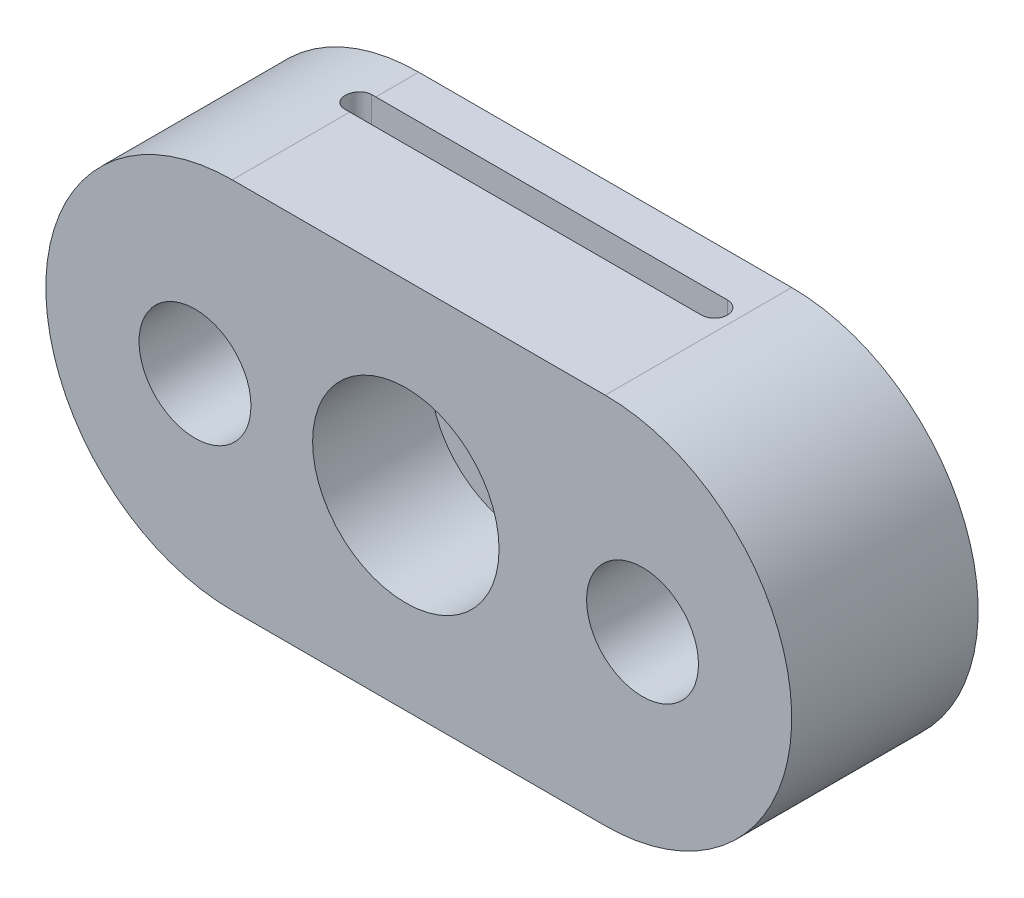
ISO-10303-21;
HEADER;
FILE_DESCRIPTION(('STEP AP214'),'2;1');
FILE_NAME('part.step','',(''),(''),'','','');
FILE_SCHEMA(('AUTOMOTIVE_DESIGN { 1 0 10303 214 1 1 1 1 }'));
ENDSEC;
DATA;
#1=APPLICATION_CONTEXT('core data for automotive mechanical design processes');
#2=APPLICATION_PROTOCOL_DEFINITION('international standard','automotive_design',2000,#1);
#3=PRODUCT_CONTEXT('',#1,'mechanical');
#4=PRODUCT('Part','Part','',(#3));
#5=PRODUCT_RELATED_PRODUCT_CATEGORY('part','',(#4));
#6=PRODUCT_DEFINITION_FORMATION('','',#4);
#7=PRODUCT_DEFINITION_CONTEXT('part definition',#1,'design');
#8=PRODUCT_DEFINITION('design','',#6,#7);
#9=PRODUCT_DEFINITION_SHAPE('','',#8);
#10=(LENGTH_UNIT() NAMED_UNIT(*) SI_UNIT(.MILLI.,.METRE.));
#11=(NAMED_UNIT(*) PLANE_ANGLE_UNIT() SI_UNIT($,.RADIAN.));
#12=(NAMED_UNIT(*) SI_UNIT($,.STERADIAN.) SOLID_ANGLE_UNIT());
#13=UNCERTAINTY_MEASURE_WITH_UNIT(LENGTH_MEASURE(1.E-05),#10,'distance_accuracy_value','');
#14=(GEOMETRIC_REPRESENTATION_CONTEXT(3) GLOBAL_UNCERTAINTY_ASSIGNED_CONTEXT((#13)) GLOBAL_UNIT_ASSIGNED_CONTEXT((#10,
#11,#12)) REPRESENTATION_CONTEXT('',''));
#15=CARTESIAN_POINT('',(0.,0.,0.));
#16=DIRECTION('',(0.,0.,1.));
#17=DIRECTION('',(1.,0.,0.));
#18=AXIS2_PLACEMENT_3D('',#15,#16,#17);
#19=CARTESIAN_POINT('',(10.6935805521572,0.,7.));
#20=DIRECTION('',(0.,0.,-1.));
#21=DIRECTION('',(-1.,0.,0.));
#22=AXIS2_PLACEMENT_3D('',#19,#20,#21);
#23=CYLINDRICAL_SURFACE('',#22,10.);
#24=DIRECTION('',(0.,0.,-1.));
#25=VECTOR('',#24,1.);
#26=CARTESIAN_POINT('',(10.6935805521572,-10.,7.));
#27=LINE('',#26,#25);
#28=CARTESIAN_POINT('',(10.6935805521572,-10.,7.));
#29=VERTEX_POINT('',#28);
#30=CARTESIAN_POINT('',(10.6935805521572,-10.,-3.));
#31=VERTEX_POINT('',#30);
#32=EDGE_CURVE('E147',#29,#31,#27,.T.);
#33=ORIENTED_EDGE('',*,*,#32,.T.);
#34=CARTESIAN_POINT('',(10.6935805521572,0.,-3.));
#35=DIRECTION('',(0.,0.,-1.));
#36=DIRECTION('',(1.,0.,0.));
#37=AXIS2_PLACEMENT_3D('',#34,#35,#36);
#38=CIRCLE('',#37,10.);
#39=CARTESIAN_POINT('',(10.6935805521572,10.,-3.));
#40=VERTEX_POINT('',#39);
#41=EDGE_CURVE('E141',#40,#31,#38,.T.);
#42=ORIENTED_EDGE('',*,*,#41,.F.);
#43=DIRECTION('',(0.,0.,-1.));
#44=VECTOR('',#43,1.);
#45=CARTESIAN_POINT('',(10.6935805521572,10.,7.));
#46=LINE('',#45,#44);
#47=CARTESIAN_POINT('',(10.6935805521572,10.,7.));
#48=VERTEX_POINT('',#47);
#49=EDGE_CURVE('E144',#48,#40,#46,.T.);
#50=ORIENTED_EDGE('',*,*,#49,.F.);
#51=CARTESIAN_POINT('',(10.6935805521572,0.,7.));
#52=DIRECTION('',(0.,0.,1.));
#53=DIRECTION('',(1.,0.,0.));
#54=AXIS2_PLACEMENT_3D('',#51,#52,#53);
#55=CIRCLE('',#54,10.);
#56=EDGE_CURVE('E197',#29,#48,#55,.T.);
#57=ORIENTED_EDGE('',*,*,#56,.F.);
#58=EDGE_LOOP('',(#33,#42,#50,#57));
#59=FACE_BOUND('',#58,.T.);
#60=ADVANCED_FACE('F38',(#59),#23,.T.);
#61=CARTESIAN_POINT('',(0.,10.,7.));
#62=DIRECTION('',(0.,1.,0.));
#63=DIRECTION('',(0.,0.,1.));
#64=AXIS2_PLACEMENT_3D('',#61,#62,#63);
#65=PLANE('',#64);
#66=DIRECTION('',(-1.,0.,0.));
#67=VECTOR('',#66,1.);
#68=CARTESIAN_POINT('',(0.,10.,-0.7));
#69=LINE('',#68,#67);
#70=CARTESIAN_POINT('',(9.55,10.,-0.7));
#71=VERTEX_POINT('',#70);
#72=CARTESIAN_POINT('',(-9.30641944784282,10.,-0.7));
#73=VERTEX_POINT('',#72);
#74=EDGE_CURVE('E153',#71,#73,#69,.T.);
#75=ORIENTED_EDGE('',*,*,#74,.F.);
#76=CARTESIAN_POINT('',(9.55,10.,0.));
#77=DIRECTION('',(0.,1.,0.));
#78=DIRECTION('',(0.,0.,1.));
#79=AXIS2_PLACEMENT_3D('',#76,#77,#78);
#80=CIRCLE('',#79,0.7);
#81=CARTESIAN_POINT('',(9.55,10.,0.7));
#82=VERTEX_POINT('',#81);
#83=EDGE_CURVE('E333',#82,#71,#80,.T.);
#84=ORIENTED_EDGE('',*,*,#83,.F.);
#85=DIRECTION('',(1.,0.,0.));
#86=VECTOR('',#85,1.);
#87=CARTESIAN_POINT('',(0.,10.,0.7));
#88=LINE('',#87,#86);
#89=CARTESIAN_POINT('',(-9.30641944784282,10.,0.7));
#90=VERTEX_POINT('',#89);
#91=EDGE_CURVE('E378',#90,#82,#88,.T.);
#92=ORIENTED_EDGE('',*,*,#91,.F.);
#93=DIRECTION('',(0.,0.,-1.));
#94=VECTOR('',#93,1.);
#95=CARTESIAN_POINT('',(-9.30641944784282,10.,7.));
#96=LINE('',#95,#94);
#97=CARTESIAN_POINT('',(-9.30641944784282,10.,7.));
#98=VERTEX_POINT('',#97);
#99=EDGE_CURVE('E166',#98,#90,#96,.T.);
#100=ORIENTED_EDGE('',*,*,#99,.F.);
#101=DIRECTION('',(1.,0.,0.));
#102=VECTOR('',#101,1.);
#103=CARTESIAN_POINT('',(0.,10.,7.));
#104=LINE('',#103,#102);
#105=EDGE_CURVE('E164',#98,#48,#104,.T.);
#106=ORIENTED_EDGE('',*,*,#105,.T.);
#107=ORIENTED_EDGE('',*,*,#49,.T.);
#108=DIRECTION('',(1.,0.,0.));
#109=VECTOR('',#108,1.);
#110=CARTESIAN_POINT('',(10.6935805521572,10.,-3.));
#111=LINE('',#110,#109);
#112=CARTESIAN_POINT('',(-9.30641944784282,10.,-3.));
#113=VERTEX_POINT('',#112);
#114=EDGE_CURVE('E161',#113,#40,#111,.T.);
#115=ORIENTED_EDGE('',*,*,#114,.F.);
#116=EDGE_CURVE('E211',#73,#113,#96,.T.);
#117=ORIENTED_EDGE('',*,*,#116,.F.);
#118=EDGE_LOOP('',(#75,#84,#92,#100,#106,#107,#115,#117));
#119=FACE_BOUND('',#118,.T.);
#120=ADVANCED_FACE('F158',(#119),#65,.T.);
#121=CARTESIAN_POINT('',(-9.30641944784282,0.,7.));
#122=DIRECTION('',(0.,0.,-1.));
#123=DIRECTION('',(-1.,0.,0.));
#124=AXIS2_PLACEMENT_3D('',#121,#122,#123);
#125=CYLINDRICAL_SURFACE('',#124,10.);
#126=DIRECTION('',(0.,0.,-1.));
#127=VECTOR('',#126,1.);
#128=CARTESIAN_POINT('',(-9.30641944784282,-10.,7.));
#129=LINE('',#128,#127);
#130=CARTESIAN_POINT('',(-9.30641944784282,-10.,-0.7));
#131=VERTEX_POINT('',#130);
#132=CARTESIAN_POINT('',(-9.30641944784282,-10.,-3.));
#133=VERTEX_POINT('',#132);
#134=EDGE_CURVE('E207',#131,#133,#129,.T.);
#135=ORIENTED_EDGE('',*,*,#134,.F.);
#136=CARTESIAN_POINT('',(-9.30641944784282,0.,-0.7));
#137=DIRECTION('',(0.,0.,-1.));
#138=DIRECTION('',(-1.,0.,0.));
#139=AXIS2_PLACEMENT_3D('',#136,#137,#138);
#140=CIRCLE('',#139,10.);
#141=CARTESIAN_POINT('',(-9.55,-9.99703298557181,-0.7));
#142=VERTEX_POINT('',#141);
#143=EDGE_CURVE('E374',#131,#142,#140,.T.);
#144=ORIENTED_EDGE('',*,*,#143,.T.);
#145=CARTESIAN_POINT('',(-9.55,-9.99703298557181,-0.7));
#146=CARTESIAN_POINT('',(-9.58938115904723,-9.99608239226732,-0.700033379819533));
#147=CARTESIAN_POINT('',(-9.62874431219714,-9.99488177531173,-0.696678761885616));
#148=CARTESIAN_POINT('',(-9.70631123027237,-9.99207405099505,-0.683447650697021));
#149=CARTESIAN_POINT('',(-9.74451595180119,-9.99046728985497,-0.67357670085131));
#150=CARTESIAN_POINT('',(-9.81872774334315,-9.98693821557732,-0.647561173034608));
#151=CARTESIAN_POINT('',(-9.85473394891882,-9.98501577940121,-0.631414145511154));
#152=CARTESIAN_POINT('',(-9.92351683216518,-9.98100072729197,-0.593320878172882));
#153=CARTESIAN_POINT('',(-9.9562939814118,-9.9789081362902,-0.571375486888031));
#154=CARTESIAN_POINT('',(-10.0177673128961,-9.97471493312656,-0.52225007101906));
#155=CARTESIAN_POINT('',(-10.0464551104132,-9.97261431330132,-0.495059552955412));
#156=CARTESIAN_POINT('',(-10.0988642378598,-9.96858684568168,-0.436233881005774));
#157=CARTESIAN_POINT('',(-10.1225848521364,-9.96666002295003,-0.404598087757234));
#158=CARTESIAN_POINT('',(-10.1643799591693,-9.96314936948808,-0.337772801169846));
#159=CARTESIAN_POINT('',(-10.1824540343428,-9.96156556412785,-0.302583045256698));
#160=CARTESIAN_POINT('',(-10.2124306440172,-9.95888405004982,-0.229651555057913));
#161=CARTESIAN_POINT('',(-10.2243336984014,-9.95778630038494,-0.191910036050851));
#162=CARTESIAN_POINT('',(-10.2415923690351,-9.95618035443391,-0.115085073322615));
#163=CARTESIAN_POINT('',(-10.2469707172015,-9.95567011160635,-0.0760067791556619));
#164=CARTESIAN_POINT('',(-10.2510983239586,-9.95527932083851,0.00250197557487441));
#165=CARTESIAN_POINT('',(-10.2498475687754,-9.95539877420661,0.0419324368700175));
#166=CARTESIAN_POINT('',(-10.2407671268538,-9.95625505083645,0.119903224447776));
#167=CARTESIAN_POINT('',(-10.2329567879185,-9.95699005847367,0.158445826399767));
#168=CARTESIAN_POINT('',(-10.2110094293138,-9.95900785110239,0.233669981670766));
#169=CARTESIAN_POINT('',(-10.1968723800451,-9.96029063865666,0.270351526282024));
#170=CARTESIAN_POINT('',(-10.1626524237927,-9.96329057393142,0.340874513709697));
#171=CARTESIAN_POINT('',(-10.1425607960384,-9.96500835818491,0.374711696864777));
#172=CARTESIAN_POINT('',(-10.097011402964,-9.96872533027111,0.438538082268754));
#173=CARTESIAN_POINT('',(-10.0715537614128,-9.97072451161294,0.468527373244982));
#174=CARTESIAN_POINT('',(-10.0158821428139,-9.97484050070938,0.523929355307824));
#175=CARTESIAN_POINT('',(-9.98565046106173,-9.97695772653662,0.549324224124753));
#176=CARTESIAN_POINT('',(-9.92133898518689,-9.98112771147946,0.5946897764578));
#177=CARTESIAN_POINT('',(-9.88725795272139,-9.98318044957624,0.614658707363758));
#178=CARTESIAN_POINT('',(-9.8161481149597,-9.98706399682385,0.648631096795004));
#179=CARTESIAN_POINT('',(-9.77911322061616,-9.98889432684008,0.662621834001193));
#180=CARTESIAN_POINT('',(-9.70323170535793,-9.99219571557429,0.684156681436283));
#181=CARTESIAN_POINT('',(-9.66438795170969,-9.99366732127803,0.691710650958482));
#182=CARTESIAN_POINT('',(-9.61272899269142,-9.99531555825584,0.697297749468899));
#183=CARTESIAN_POINT('',(-9.6001944975737,-9.99569180663932,0.698311564217434));
#184=CARTESIAN_POINT('',(-9.57510857769922,-9.99639748011712,0.699661772042809));
#185=CARTESIAN_POINT('',(-9.56255721535694,-9.99672698172304,0.699999284209562));
#186=CARTESIAN_POINT('',(-9.55,-9.99703298557181,0.7));
#187=B_SPLINE_CURVE_WITH_KNOTS('',3,(#145,#146,#147,#148,#149,#150,#151,#152,#153,#154,#155,
#156,#157,#158,#159,#160,#161,#162,#163,#164,#165,#166,#167,#168,#169,#170,#171,#172,#173,#174,
#175,#176,#177,#178,#179,#180,#181,#182,#183,#184,#185,#186),.UNSPECIFIED.,.F.,.F.,(4,2,2,2,2,2,
2,2,2,2,2,2,2,2,2,2,2,2,2,2,4),(0.,0.118017329466049,0.235934391368063,0.353897522576417,
0.471843400664647,0.590027737226599,0.708229089637684,0.82643918141286,0.944639312850112,
1.06242644423521,1.18021382035759,1.29765499220524,1.41509671350082,1.53271129110395,
1.65032315618205,1.76838190093168,1.88647873414739,2.0048256353484,2.1229909352984,
2.1607211459729,2.19838887206872),.UNSPECIFIED.);
#188=CARTESIAN_POINT('',(-9.55,-9.99703298557181,0.7));
#189=VERTEX_POINT('',#188);
#190=EDGE_CURVE('E289',#142,#189,#187,.T.);
#191=ORIENTED_EDGE('',*,*,#190,.T.);
#192=CARTESIAN_POINT('',(-9.30641944784282,0.,0.7));
#193=DIRECTION('',(0.,0.,1.));
#194=DIRECTION('',(1.,0.,0.));
#195=AXIS2_PLACEMENT_3D('',#192,#193,#194);
#196=CIRCLE('',#195,10.);
#197=CARTESIAN_POINT('',(-9.30641944784282,-10.,0.7));
#198=VERTEX_POINT('',#197);
#199=EDGE_CURVE('E377',#189,#198,#196,.T.);
#200=ORIENTED_EDGE('',*,*,#199,.T.);
#201=CARTESIAN_POINT('',(-9.30641944784282,-10.,7.));
#202=VERTEX_POINT('',#201);
#203=EDGE_CURVE('E208',#202,#198,#129,.T.);
#204=ORIENTED_EDGE('',*,*,#203,.F.);
#205=CARTESIAN_POINT('',(-9.30641944784282,0.,7.));
#206=DIRECTION('',(0.,0.,1.));
#207=DIRECTION('',(1.,0.,0.));
#208=AXIS2_PLACEMENT_3D('',#205,#206,#207);
#209=CIRCLE('',#208,10.);
#210=EDGE_CURVE('E200',#98,#202,#209,.T.);
#211=ORIENTED_EDGE('',*,*,#210,.F.);
#212=ORIENTED_EDGE('',*,*,#99,.T.);
#213=CARTESIAN_POINT('',(-9.55,9.99703298557181,0.7));
#214=VERTEX_POINT('',#213);
#215=EDGE_CURVE('E380',#90,#214,#196,.T.);
#216=ORIENTED_EDGE('',*,*,#215,.T.);
#217=CARTESIAN_POINT('',(-9.55,9.99703298557181,0.7));
#218=CARTESIAN_POINT('',(-9.58938115904723,9.99608239226731,0.700033379819533));
#219=CARTESIAN_POINT('',(-9.62874431219714,9.99488177531173,0.696678761885616));
#220=CARTESIAN_POINT('',(-9.70631123027237,9.99207405099505,0.683447650697021));
#221=CARTESIAN_POINT('',(-9.74451595180119,9.99046728985497,0.67357670085131));
#222=CARTESIAN_POINT('',(-9.81872774334315,9.98693821557732,0.647561173034608));
#223=CARTESIAN_POINT('',(-9.85473394891882,9.98501577940121,0.631414145511154));
#224=CARTESIAN_POINT('',(-9.92351683216518,9.98100072729197,0.593320878172882));
#225=CARTESIAN_POINT('',(-9.9562939814118,9.9789081362902,0.571375486888031));
#226=CARTESIAN_POINT('',(-10.0177673128961,9.97471493312656,0.52225007101906));
#227=CARTESIAN_POINT('',(-10.0464551104132,9.97261431330132,0.495059552955412));
#228=CARTESIAN_POINT('',(-10.0988642378598,9.96858684568168,0.436233881005774));
#229=CARTESIAN_POINT('',(-10.1225848521364,9.96666002295003,0.404598087757234));
#230=CARTESIAN_POINT('',(-10.1643799591693,9.96314936948808,0.337772801169846));
#231=CARTESIAN_POINT('',(-10.1824540343428,9.96156556412785,0.302583045256698));
#232=CARTESIAN_POINT('',(-10.2124306440172,9.95888405004982,0.229651555057913));
#233=CARTESIAN_POINT('',(-10.2243336984014,9.95778630038494,0.191910036050851));
#234=CARTESIAN_POINT('',(-10.2415923690351,9.95618035443391,0.115085073322615));
#235=CARTESIAN_POINT('',(-10.2469707172015,9.95567011160635,0.0760067791556619));
#236=CARTESIAN_POINT('',(-10.2510983239586,9.95527932083851,-0.00250197557487446));
#237=CARTESIAN_POINT('',(-10.2498475687754,9.95539877420661,-0.0419324368700176));
#238=CARTESIAN_POINT('',(-10.2407671268538,9.95625505083645,-0.119903224447776));
#239=CARTESIAN_POINT('',(-10.2329567879185,9.95699005847367,-0.158445826399767));
#240=CARTESIAN_POINT('',(-10.2110094293138,9.95900785110239,-0.233669981670766));
#241=CARTESIAN_POINT('',(-10.1968723800451,9.96029063865666,-0.270351526282024));
#242=CARTESIAN_POINT('',(-10.1626524237927,9.96329057393142,-0.340874513709697));
#243=CARTESIAN_POINT('',(-10.1425607960384,9.96500835818491,-0.374711696864777));
#244=CARTESIAN_POINT('',(-10.097011402964,9.96872533027111,-0.438538082268754));
#245=CARTESIAN_POINT('',(-10.0715537614128,9.97072451161294,-0.468527373244982));
#246=CARTESIAN_POINT('',(-10.0158821428139,9.97484050070938,-0.523929355307823));
#247=CARTESIAN_POINT('',(-9.98565046106173,9.97695772653662,-0.549324224124753));
#248=CARTESIAN_POINT('',(-9.92133898518689,9.98112771147946,-0.5946897764578));
#249=CARTESIAN_POINT('',(-9.88725795272139,9.98318044957624,-0.614658707363757));
#250=CARTESIAN_POINT('',(-9.8161481149597,9.98706399682385,-0.648631096795004));
#251=CARTESIAN_POINT('',(-9.77911322061616,9.98889432684009,-0.662621834001192));
#252=CARTESIAN_POINT('',(-9.70323170535793,9.99219571557429,-0.684156681436282));
#253=CARTESIAN_POINT('',(-9.66438795170969,9.99366732127803,-0.691710650958482));
#254=CARTESIAN_POINT('',(-9.61272899269142,9.99531555825584,-0.697297749468899));
#255=CARTESIAN_POINT('',(-9.6001944975737,9.99569180663932,-0.698311564217434));
#256=CARTESIAN_POINT('',(-9.57510857769922,9.99639748011712,-0.699661772042809));
#257=CARTESIAN_POINT('',(-9.56255721535694,9.99672698172304,-0.699999284209562));
#258=CARTESIAN_POINT('',(-9.55,9.99703298557181,-0.7));
#259=B_SPLINE_CURVE_WITH_KNOTS('',3,(#217,#218,#219,#220,#221,#222,#223,#224,#225,#226,#227,
#228,#229,#230,#231,#232,#233,#234,#235,#236,#237,#238,#239,#240,#241,#242,#243,#244,#245,#246,
#247,#248,#249,#250,#251,#252,#253,#254,#255,#256,#257,#258),.UNSPECIFIED.,.F.,.F.,(4,2,2,2,2,2,
2,2,2,2,2,2,2,2,2,2,2,2,2,2,4),(0.,0.118017329466051,0.235934391368062,0.353897522576417,
0.471843400664646,0.590027737226599,0.708229089637684,0.826439181412859,0.944639312850112,
1.06242644423521,1.18021382035759,1.29765499220524,1.41509671350082,1.53271129110395,
1.65032315618205,1.76838190093167,1.88647873414739,2.0048256353484,2.1229909352984,
2.1607211459729,2.19838887206872),.UNSPECIFIED.);
#260=CARTESIAN_POINT('',(-9.55,9.99703298557181,-0.7));
#261=VERTEX_POINT('',#260);
#262=EDGE_CURVE('E231',#214,#261,#259,.T.);
#263=ORIENTED_EDGE('',*,*,#262,.T.);
#264=EDGE_CURVE('E370',#261,#73,#140,.T.);
#265=ORIENTED_EDGE('',*,*,#264,.T.);
#266=ORIENTED_EDGE('',*,*,#116,.T.);
#267=CARTESIAN_POINT('',(-9.30641944784282,0.,-3.));
#268=DIRECTION('',(0.,0.,-1.));
#269=DIRECTION('',(-1.,0.,0.));
#270=AXIS2_PLACEMENT_3D('',#267,#268,#269);
#271=CIRCLE('',#270,10.);
#272=EDGE_CURVE('E180',#133,#113,#271,.T.);
#273=ORIENTED_EDGE('',*,*,#272,.F.);
#274=EDGE_LOOP('',(#135,#144,#191,#200,#204,#211,#212,#216,#263,#265,#266,#273));
#275=FACE_BOUND('',#274,.T.);
#276=ADVANCED_FACE('F253',(#275),#125,.T.);
#277=CARTESIAN_POINT('',(-11.3064194478428,0.,7.));
#278=DIRECTION('',(0.,0.,-1.));
#279=DIRECTION('',(-1.,0.,0.));
#280=AXIS2_PLACEMENT_3D('',#277,#278,#279);
#281=CYLINDRICAL_SURFACE('',#280,3.);
#282=CARTESIAN_POINT('',(-10.25,-2.80784222317057,0.));
#283=CARTESIAN_POINT('',(-10.250041632278,-2.80783676092134,0.0371729183333262));
#284=CARTESIAN_POINT('',(-10.2470415950016,-2.80672887402205,0.0743307089283676));
#285=CARTESIAN_POINT('',(-10.2352694040919,-2.80226843135836,0.147516901205948));
#286=CARTESIAN_POINT('',(-10.2265074266941,-2.79891983276063,0.183547176897491));
#287=CARTESIAN_POINT('',(-10.2035175867712,-2.78993725526753,0.253526576421936));
#288=CARTESIAN_POINT('',(-10.1892882965192,-2.78430267939357,0.28747515395544));
#289=CARTESIAN_POINT('',(-10.1559439886246,-2.77069149341525,0.352365885615565));
#290=CARTESIAN_POINT('',(-10.1368286459055,-2.76271472747618,0.38330783951783));
#291=CARTESIAN_POINT('',(-10.0941898128982,-2.74427459757084,0.441796679753795));
#292=CARTESIAN_POINT('',(-10.0706127268253,-2.73378053536446,0.469294715255574));
#293=CARTESIAN_POINT('',(-10.0201448086505,-2.71040035922793,0.519846076417543));
#294=CARTESIAN_POINT('',(-9.99325450104453,-2.697514623746,0.542900104103696));
#295=CARTESIAN_POINT('',(-9.93567851397689,-2.66873653865378,0.585316757903214));
#296=CARTESIAN_POINT('',(-9.90486869246659,-2.65272352425349,0.604428130510832));
#297=CARTESIAN_POINT('',(-9.8416856702169,-2.61836867734181,0.637331697029364));
#298=CARTESIAN_POINT('',(-9.80930978952326,-2.60002275846298,0.651114381677683));
#299=CARTESIAN_POINT('',(-9.73881438669924,-2.55822843941091,0.675239520868553));
#300=CARTESIAN_POINT('',(-9.70059887188726,-2.5344323482634,0.684688687387435));
#301=CARTESIAN_POINT('',(-9.62467714994031,-2.48472394955571,0.697067690790403));
#302=CARTESIAN_POINT('',(-9.58696958610349,-2.45881975172116,0.700021390260577));
#303=CARTESIAN_POINT('',(-9.55,-2.43207539423422,0.7));
#304=B_SPLINE_CURVE_WITH_KNOTS('',3,(#282,#283,#284,#285,#286,#287,#288,#289,#290,#291,#292,
#293,#294,#295,#296,#297,#298,#299,#300,#301,#302,#303),.UNSPECIFIED.,.F.,.F.,(4,2,2,2,2,2,2,2,
2,2,4),(0.,0.111358686358903,0.222521227029597,0.333712816290647,0.444911805223579,
0.557542752369458,0.670155892444058,0.788568632991954,0.907191721179736,1.04464328488791,
1.18158903925689),.UNSPECIFIED.);
#305=CARTESIAN_POINT('',(-10.25,-2.80784222317057,0.));
#306=VERTEX_POINT('',#305);
#307=CARTESIAN_POINT('',(-9.55,-2.43207539423422,0.7));
#308=VERTEX_POINT('',#307);
#309=EDGE_CURVE('E220',#306,#308,#304,.T.);
#310=ORIENTED_EDGE('',*,*,#309,.F.);
#311=CARTESIAN_POINT('',(-11.3064194478428,0.,0.));
#312=DIRECTION('',(0.,0.,1.));
#313=DIRECTION('',(1.,0.,0.));
#314=AXIS2_PLACEMENT_3D('',#311,#312,#313);
#315=CIRCLE('',#314,3.);
#316=CARTESIAN_POINT('',(-10.25,2.80784222317058,0.));
#317=VERTEX_POINT('',#316);
#318=EDGE_CURVE('E183',#317,#306,#315,.T.);
#319=ORIENTED_EDGE('',*,*,#318,.F.);
#320=CARTESIAN_POINT('',(-9.55,2.43207539423422,0.7));
#321=CARTESIAN_POINT('',(-9.57021288531672,2.44667429502517,0.699997800023315));
#322=CARTESIAN_POINT('',(-9.59060457862926,2.46101555330447,0.699123647965676));
#323=CARTESIAN_POINT('',(-9.63164430456963,2.48912579492267,0.695528715152576));
#324=CARTESIAN_POINT('',(-9.65229255476161,2.50289424238783,0.692806244738331));
#325=CARTESIAN_POINT('',(-9.71467798747564,2.54338673214261,0.681667067833616));
#326=CARTESIAN_POINT('',(-9.7565946077836,2.56910959825297,0.670275857646046));
#327=CARTESIAN_POINT('',(-9.83945423361953,2.61731285649481,0.638897780469893));
#328=CARTESIAN_POINT('',(-9.88039008124469,2.6397733326804,0.618860858330736));
#329=CARTESIAN_POINT('',(-9.95880343203529,2.68064876769944,0.570085325751347));
#330=CARTESIAN_POINT('',(-9.99629343830103,2.69907871670087,0.541379937474949));
#331=CARTESIAN_POINT('',(-10.0604632869848,2.72922426365179,0.480708747772555));
#332=CARTESIAN_POINT('',(-10.087921796248,2.74153013637281,0.449856502684062));
#333=CARTESIAN_POINT('',(-10.1373758269758,2.7629813475822,0.383033199903502));
#334=CARTESIAN_POINT('',(-10.1593692502333,2.77212547270859,0.347060184508472));
#335=CARTESIAN_POINT('',(-10.1948243053033,2.78651868928904,0.275045706928112));
#336=CARTESIAN_POINT('',(-10.208920981865,2.79206674298021,0.239373996621067));
#337=CARTESIAN_POINT('',(-10.2311171997314,2.80069081020428,0.165962517277616));
#338=CARTESIAN_POINT('',(-10.2392272921748,2.80377117377338,0.128226513219777));
#339=CARTESIAN_POINT('',(-10.2461196521997,2.80637972090172,0.0751383440049892));
#340=CARTESIAN_POINT('',(-10.247574914896,2.80692881683948,0.0601401223866364));
#341=CARTESIAN_POINT('',(-10.2495139365148,2.80765948111237,0.0300970317425144));
#342=CARTESIAN_POINT('',(-10.2499993004761,2.80784165665032,0.0150522811168571));
#343=CARTESIAN_POINT('',(-10.25,2.80784222317058,0.));
#344=B_SPLINE_CURVE_WITH_KNOTS('',3,(#320,#321,#322,#323,#324,#325,#326,#327,#328,#329,#330,
#331,#332,#333,#334,#335,#336,#337,#338,#339,#340,#341,#342,#343),.UNSPECIFIED.,.F.,.F.,(4,2,2,
2,2,2,2,2,2,2,2,4),(0.,0.0747678804531909,0.149604202912556,0.300231881606609,0.451743587255925,
0.602681834445122,0.731252318831914,0.859872089202681,0.975573742298542,1.09107098530303,
1.13627876474562,1.18141166985446),.UNSPECIFIED.);
#345=CARTESIAN_POINT('',(-9.55,2.43207539423422,0.7));
#346=VERTEX_POINT('',#345);
#347=EDGE_CURVE('E223',#346,#317,#344,.T.);
#348=ORIENTED_EDGE('',*,*,#347,.F.);
#349=CARTESIAN_POINT('',(-11.3064194478428,0.,0.7));
#350=DIRECTION('',(0.,0.,1.));
#351=DIRECTION('',(1.,0.,0.));
#352=AXIS2_PLACEMENT_3D('',#349,#350,#351);
#353=CIRCLE('',#352,3.);
#354=EDGE_CURVE('E230',#308,#346,#353,.T.);
#355=ORIENTED_EDGE('',*,*,#354,.F.);
#356=EDGE_LOOP('',(#310,#319,#348,#355));
#357=FACE_BOUND('',#356,.T.);
#358=CARTESIAN_POINT('',(-11.3064194478428,0.,7.));
#359=DIRECTION('',(0.,0.,1.));
#360=DIRECTION('',(1.,0.,0.));
#361=AXIS2_PLACEMENT_3D('',#358,#359,#360);
#362=CIRCLE('',#361,3.);
#363=CARTESIAN_POINT('',(-8.30641944784282,0.,7.));
#364=VERTEX_POINT('',#363);
#365=EDGE_CURVE('E194',#364,#364,#362,.T.);
#366=ORIENTED_EDGE('',*,*,#365,.T.);
#367=EDGE_LOOP('',(#366));
#368=FACE_BOUND('',#367,.T.);
#369=ADVANCED_FACE('F228',(#357,#368),#281,.F.);
#370=CARTESIAN_POINT('',(12.6935805521572,0.,7.));
#371=DIRECTION('',(0.,0.,-1.));
#372=DIRECTION('',(-1.,0.,0.));
#373=AXIS2_PLACEMENT_3D('',#370,#371,#372);
#374=CYLINDRICAL_SURFACE('',#373,3.);
#375=CARTESIAN_POINT('',(10.25,1.74037756970124,0.));
#376=CARTESIAN_POINT('',(10.2500023000171,1.74037946581805,0.0135628841683726));
#377=CARTESIAN_POINT('',(10.2496053904134,1.73982362328582,0.0271164982343388));
#378=CARTESIAN_POINT('',(10.2480381783542,1.73762059221648,0.0540774410261438));
#379=CARTESIAN_POINT('',(10.2468685859515,1.73597440564177,0.0674848925797735));
#380=CARTESIAN_POINT('',(10.2422711108838,1.72948287974726,0.1070418072583));
#381=CARTESIAN_POINT('',(10.2377533164531,1.72308331994432,0.132829086433135));
#382=CARTESIAN_POINT('',(10.2262779288763,1.70660943717129,0.182478301417414));
#383=CARTESIAN_POINT('',(10.2193281597376,1.69654689440685,0.206346113145876));
#384=CARTESIAN_POINT('',(10.2035545809798,1.6733107186247,0.251891009025054));
#385=CARTESIAN_POINT('',(10.1947260443998,1.6601292288278,0.273562359985306));
#386=CARTESIAN_POINT('',(10.1718189610917,1.62521127854366,0.323055777655349));
#387=CARTESIAN_POINT('',(10.1570869328921,1.60220018940605,0.34967097107953));
#388=CARTESIAN_POINT('',(10.126357959354,1.55249169108015,0.398298410508001));
#389=CARTESIAN_POINT('',(10.1103586238866,1.52578724194766,0.420301659216673));
#390=CARTESIAN_POINT('',(10.0684092290418,1.45297002973318,0.472167071677876));
#391=CARTESIAN_POINT('',(10.0422154515264,1.40478079083013,0.49888980591718));
#392=CARTESIAN_POINT('',(9.99128558365777,1.30415331916557,0.544458560250317));
#393=CARTESIAN_POINT('',(9.96655308393499,1.25170531547609,0.563285819185344));
#394=CARTESIAN_POINT('',(9.92172642835638,1.1487795305026,0.593702705773787));
#395=CARTESIAN_POINT('',(9.90141555014949,1.09853652621657,0.605784523615493));
#396=CARTESIAN_POINT('',(9.86333992865375,0.996351296275268,0.626327546519725));
#397=CARTESIAN_POINT('',(9.84557724450199,0.944407737604621,0.634785834330708));
#398=CARTESIAN_POINT('',(9.81281820716737,0.839196510024043,0.649034448520122));
#399=CARTESIAN_POINT('',(9.79782731967219,0.785926455111788,0.654819536591875));
#400=CARTESIAN_POINT('',(9.77078147123964,0.678467268372861,0.664424868555699));
#401=CARTESIAN_POINT('',(9.75872728947024,0.624277896703044,0.66824459129451));
#402=CARTESIAN_POINT('',(9.73277333600054,0.49010100268071,0.67591155079259));
#403=CARTESIAN_POINT('',(9.72058284966723,0.409732573535811,0.678960327753228));
#404=CARTESIAN_POINT('',(9.70276045551432,0.248201513675276,0.683188381312371));
#405=CARTESIAN_POINT('',(9.69713145928629,0.167038546488009,0.684366828055501));
#406=CARTESIAN_POINT('',(9.69248168607958,0.00447961937307053,0.685350013504244));
#407=CARTESIAN_POINT('',(9.69346383458938,-0.0769164277677463,0.685154144061487));
#408=CARTESIAN_POINT('',(9.70203686106643,-0.239320112909883,0.683304601496481));
#409=CARTESIAN_POINT('',(9.70962523328737,-0.320327886470783,0.681651481107776));
#410=CARTESIAN_POINT('',(9.72857206895385,-0.460861469612145,0.676889124748783));
#411=CARTESIAN_POINT('',(9.73847773695847,-0.520602867227881,0.67425808695889));
#412=CARTESIAN_POINT('',(9.76186102621328,-0.639277611382979,0.667281653152155));
#413=CARTESIAN_POINT('',(9.77533792395656,-0.698211119054729,0.662936604295298));
#414=CARTESIAN_POINT('',(9.80570561058556,-0.814732640453117,0.65182463618885));
#415=CARTESIAN_POINT('',(9.82258349079522,-0.872324849677222,0.645066802140474));
#416=CARTESIAN_POINT('',(9.85958679994357,-0.985921588529018,0.628148714154091));
#417=CARTESIAN_POINT('',(9.87970972466978,-1.04192730358953,0.617991077406539));
#418=CARTESIAN_POINT('',(9.92094276577521,-1.14689632614419,0.594069514785777));
#419=CARTESIAN_POINT('',(9.94180787446867,-1.19604421483702,0.580704342385517));
#420=CARTESIAN_POINT('',(9.98549273669203,-1.29191144789003,0.548708648747213));
#421=CARTESIAN_POINT('',(10.0083170714056,-1.33862466596723,0.530065538993041));
#422=CARTESIAN_POINT('',(10.0552853325443,-1.4289958458152,0.485548008124882));
#423=CARTESIAN_POINT('',(10.0794446077708,-1.47259235576775,0.459561772003358));
#424=CARTESIAN_POINT('',(10.1267389097671,-1.5535391075224,0.398551393004232));
#425=CARTESIAN_POINT('',(10.1498794343463,-1.5909270015429,0.363585271419835));
#426=CARTESIAN_POINT('',(10.1811170703394,-1.63948353591326,0.303628155099295));
#427=CARTESIAN_POINT('',(10.1909093757807,-1.65435761188359,0.282517921961674));
#428=CARTESIAN_POINT('',(10.2088140361984,-1.68112814962552,0.237788768759894));
#429=CARTESIAN_POINT('',(10.2169260759493,-1.69302405276563,0.214169379221802));
#430=CARTESIAN_POINT('',(10.2308910878937,-1.71327621197421,0.164497967673092));
#431=CARTESIAN_POINT('',(10.236719527387,-1.72159411791557,0.138423072349864));
#432=CARTESIAN_POINT('',(10.2453652070383,-1.7338690608303,0.084829766234465));
#433=CARTESIAN_POINT('',(10.2481920255303,-1.73783997056609,0.0573162428789959));
#434=CARTESIAN_POINT('',(10.2497931226032,-1.74008632927205,0.0197688237683733));
#435=CARTESIAN_POINT('',(10.2500046879047,-1.74038254204713,0.00988169622145144));
#436=CARTESIAN_POINT('',(10.25,-1.74037756970126,0.));
#437=B_SPLINE_CURVE_WITH_KNOTS('',3,(#375,#376,#377,#378,#379,#380,#381,#382,#383,#384,#385,
#386,#387,#388,#389,#390,#391,#392,#393,#394,#395,#396,#397,#398,#399,#400,#401,#402,#403,#404,
#405,#406,#407,#408,#409,#410,#411,#412,#413,#414,#415,#416,#417,#418,#419,#420,#421,#422,#423,
#424,#425,#426,#427,#428,#429,#430,#431,#432,#433,#434,#435,#436),.UNSPECIFIED.,.F.,.F.,(4,2,2,
2,2,2,2,2,2,2,2,2,2,2,2,2,2,2,2,2,2,2,2,2,2,2,2,2,2,2,4),(0.,0.0406539996768835,
0.0812706924418948,0.16161008408886,0.241693353328248,0.321980545191982,0.435769788215018,
0.549778994329165,0.731783822877303,0.914218712226931,1.08054919699522,1.24701334151401,
1.41380231417399,1.58063549127631,1.824348795659,2.06817020411337,2.31209951273109,
2.55593633904472,2.73765899593813,2.91934486516366,3.10035369958957,3.28122351148457,
3.44608501517985,3.6113430950017,3.77926739739818,3.94613286069364,4.02872490764773,
4.11133243523687,4.19480455801088,4.27800950881524,4.30766385313988),.UNSPECIFIED.);
#438=CARTESIAN_POINT('',(10.25,1.74037756970124,0.));
#439=VERTEX_POINT('',#438);
#440=CARTESIAN_POINT('',(10.25,-1.74037756970124,0.));
#441=VERTEX_POINT('',#440);
#442=EDGE_CURVE('E322',#439,#441,#437,.T.);
#443=ORIENTED_EDGE('',*,*,#442,.F.);
#444=CARTESIAN_POINT('',(12.6935805521572,0.,0.));
#445=DIRECTION('',(0.,0.,1.));
#446=DIRECTION('',(1.,0.,0.));
#447=AXIS2_PLACEMENT_3D('',#444,#445,#446);
#448=CIRCLE('',#447,3.);
#449=EDGE_CURVE('E179',#441,#439,#448,.T.);
#450=ORIENTED_EDGE('',*,*,#449,.F.);
#451=EDGE_LOOP('',(#443,#450));
#452=FACE_BOUND('',#451,.T.);
#453=CARTESIAN_POINT('',(12.6935805521572,0.,7.));
#454=DIRECTION('',(0.,0.,1.));
#455=DIRECTION('',(1.,0.,0.));
#456=AXIS2_PLACEMENT_3D('',#453,#454,#455);
#457=CIRCLE('',#456,3.);
#458=CARTESIAN_POINT('',(15.6935805521572,0.,7.));
#459=VERTEX_POINT('',#458);
#460=EDGE_CURVE('E191',#459,#459,#457,.T.);
#461=ORIENTED_EDGE('',*,*,#460,.T.);
#462=EDGE_LOOP('',(#461));
#463=FACE_BOUND('',#462,.T.);
#464=ADVANCED_FACE('F259',(#452,#463),#374,.F.);
#465=CARTESIAN_POINT('',(0.,0.,7.));
#466=DIRECTION('',(0.,0.,-1.));
#467=DIRECTION('',(-1.,0.,0.));
#468=AXIS2_PLACEMENT_3D('',#465,#466,#467);
#469=CYLINDRICAL_SURFACE('',#468,5.);
#470=CARTESIAN_POINT('',(0.,0.,0.7));
#471=DIRECTION('',(0.,0.,1.));
#472=DIRECTION('',(1.,0.,0.));
#473=AXIS2_PLACEMENT_3D('',#470,#471,#472);
#474=CIRCLE('',#473,5.);
#475=CARTESIAN_POINT('',(-5.,0.,0.7));
#476=VERTEX_POINT('',#475);
#477=EDGE_CURVE('E296',#476,#476,#474,.T.);
#478=CARTESIAN_POINT('',(0.,0.,7.));
#479=DIRECTION('',(0.,0.,1.));
#480=DIRECTION('',(1.,0.,0.));
#481=AXIS2_PLACEMENT_3D('',#478,#479,#480);
#482=CIRCLE('',#481,5.);
#483=CARTESIAN_POINT('',(-5.,0.,7.));
#484=VERTEX_POINT('',#483);
#485=EDGE_CURVE('E188',#484,#484,#482,.T.);
#486=CARTESIAN_POINT('',(-5.,0.,0.7));
#487=CARTESIAN_POINT('',(-5.,0.,0.765625));
#488=CARTESIAN_POINT('',(-5.,0.,0.83125));
#489=CARTESIAN_POINT('',(-5.,0.,0.9625));
#490=CARTESIAN_POINT('',(-5.,0.,1.028125));
#491=CARTESIAN_POINT('',(-5.,0.,1.159375));
#492=CARTESIAN_POINT('',(-5.,0.,1.225));
#493=CARTESIAN_POINT('',(-5.,0.,1.35625));
#494=CARTESIAN_POINT('',(-5.,0.,1.421875));
#495=CARTESIAN_POINT('',(-5.,0.,1.553125));
#496=CARTESIAN_POINT('',(-5.,0.,1.61875));
#497=CARTESIAN_POINT('',(-5.,0.,1.75));
#498=CARTESIAN_POINT('',(-5.,0.,1.815625));
#499=CARTESIAN_POINT('',(-5.,0.,1.946875));
#500=CARTESIAN_POINT('',(-5.,0.,2.0125));
#501=CARTESIAN_POINT('',(-5.,0.,2.14375));
#502=CARTESIAN_POINT('',(-5.,0.,2.209375));
#503=CARTESIAN_POINT('',(-5.,0.,2.340625));
#504=CARTESIAN_POINT('',(-5.,0.,2.40625));
#505=CARTESIAN_POINT('',(-5.,0.,2.5375));
#506=CARTESIAN_POINT('',(-5.,0.,2.603125));
#507=CARTESIAN_POINT('',(-5.,0.,2.734375));
#508=CARTESIAN_POINT('',(-5.,0.,2.8));
#509=CARTESIAN_POINT('',(-5.,0.,2.93125));
#510=CARTESIAN_POINT('',(-5.,0.,2.996875));
#511=CARTESIAN_POINT('',(-5.,0.,3.128125));
#512=CARTESIAN_POINT('',(-5.,0.,3.19375));
#513=CARTESIAN_POINT('',(-5.,0.,3.325));
#514=CARTESIAN_POINT('',(-5.,0.,3.390625));
#515=CARTESIAN_POINT('',(-5.,0.,3.521875));
#516=CARTESIAN_POINT('',(-5.,0.,3.5875));
#517=CARTESIAN_POINT('',(-5.,0.,3.71875));
#518=CARTESIAN_POINT('',(-5.,0.,3.784375));
#519=CARTESIAN_POINT('',(-5.,0.,3.915625));
#520=CARTESIAN_POINT('',(-5.,0.,3.98125));
#521=CARTESIAN_POINT('',(-5.,0.,4.1125));
#522=CARTESIAN_POINT('',(-5.,0.,4.178125));
#523=CARTESIAN_POINT('',(-5.,0.,4.309375));
#524=CARTESIAN_POINT('',(-5.,0.,4.375));
#525=CARTESIAN_POINT('',(-5.,0.,4.50625));
#526=CARTESIAN_POINT('',(-5.,0.,4.571875));
#527=CARTESIAN_POINT('',(-5.,0.,4.703125));
#528=CARTESIAN_POINT('',(-5.,0.,4.76875));
#529=CARTESIAN_POINT('',(-5.,0.,4.9));
#530=CARTESIAN_POINT('',(-5.,0.,4.965625));
#531=CARTESIAN_POINT('',(-5.,0.,5.096875));
#532=CARTESIAN_POINT('',(-5.,0.,5.1625));
#533=CARTESIAN_POINT('',(-5.,0.,5.29375));
#534=CARTESIAN_POINT('',(-5.,0.,5.359375));
#535=CARTESIAN_POINT('',(-5.,0.,5.490625));
#536=CARTESIAN_POINT('',(-5.,0.,5.55625));
#537=CARTESIAN_POINT('',(-5.,0.,5.6875));
#538=CARTESIAN_POINT('',(-5.,0.,5.753125));
#539=CARTESIAN_POINT('',(-5.,0.,5.884375));
#540=CARTESIAN_POINT('',(-5.,0.,5.95));
#541=CARTESIAN_POINT('',(-5.,0.,6.08125));
#542=CARTESIAN_POINT('',(-5.,0.,6.146875));
#543=CARTESIAN_POINT('',(-5.,0.,6.278125));
#544=CARTESIAN_POINT('',(-5.,0.,6.34375));
#545=CARTESIAN_POINT('',(-5.,0.,6.475));
#546=CARTESIAN_POINT('',(-5.,0.,6.540625));
#547=CARTESIAN_POINT('',(-5.,0.,6.671875));
#548=CARTESIAN_POINT('',(-5.,0.,6.7375));
#549=CARTESIAN_POINT('',(-5.,0.,6.86875));
#550=CARTESIAN_POINT('',(-5.,0.,6.934375));
#551=CARTESIAN_POINT('',(-5.,0.,7.));
#552=B_SPLINE_CURVE_WITH_KNOTS('',3,(#486,#487,#488,#489,#490,#491,#492,#493,#494,#495,#496,
#497,#498,#499,#500,#501,#502,#503,#504,#505,#506,#507,#508,#509,#510,#511,#512,#513,#514,#515,
#516,#517,#518,#519,#520,#521,#522,#523,#524,#525,#526,#527,#528,#529,#530,#531,#532,#533,#534,
#535,#536,#537,#538,#539,#540,#541,#542,#543,#544,#545,#546,#547,#548,#549,#550,#551),
.UNSPECIFIED.,.F.,.F.,(4,2,2,2,2,2,2,2,2,2,2,2,2,2,2,2,2,2,2,2,2,2,2,2,2,2,2,2,2,2,2,2,4),(0.,
0.196875,0.39375,0.590625,0.7875,0.984375,1.18125,1.378125,1.575,1.771875,1.96875,2.165625,
2.3625,2.559375,2.75625,2.953125,3.15,3.346875,3.54375,3.740625,3.9375,4.134375,4.33125,
4.528125,4.725,4.921875,5.11875,5.315625,5.5125,5.709375,5.90625,6.103125,6.3),.UNSPECIFIED.);
#553=EDGE_CURVE('BSEAM40',#476,#484,#552,.T.);
#554=ORIENTED_EDGE('',*,*,#477,.F.);
#555=ORIENTED_EDGE('',*,*,#485,.T.);
#556=ORIENTED_EDGE('',*,*,#553,.T.);
#557=ORIENTED_EDGE('',*,*,#553,.F.);
#558=EDGE_LOOP('',(#554,#556,#555,#557));
#559=FACE_BOUND('',#558,.T.);
#560=ADVANCED_FACE('F40',(#559),#469,.F.);
#561=CARTESIAN_POINT('',(0.,-10.,7.));
#562=DIRECTION('',(0.,1.,0.));
#563=DIRECTION('',(0.,0.,1.));
#564=AXIS2_PLACEMENT_3D('',#561,#562,#563);
#565=PLANE('',#564);
#566=CARTESIAN_POINT('',(9.55,-10.,0.));
#567=DIRECTION('',(0.,-1.,0.));
#568=DIRECTION('',(0.,0.,-1.));
#569=AXIS2_PLACEMENT_3D('',#566,#567,#568);
#570=CIRCLE('',#569,0.7);
#571=CARTESIAN_POINT('',(9.55,-10.,-0.7));
#572=VERTEX_POINT('',#571);
#573=CARTESIAN_POINT('',(9.55,-10.,0.7));
#574=VERTEX_POINT('',#573);
#575=EDGE_CURVE('E61',#572,#574,#570,.T.);
#576=ORIENTED_EDGE('',*,*,#575,.F.);
#577=DIRECTION('',(-1.,0.,0.));
#578=VECTOR('',#577,1.);
#579=CARTESIAN_POINT('',(0.,-10.,-0.7));
#580=LINE('',#579,#578);
#581=EDGE_CURVE('E11',#572,#131,#580,.T.);
#582=ORIENTED_EDGE('',*,*,#581,.T.);
#583=ORIENTED_EDGE('',*,*,#134,.T.);
#584=DIRECTION('',(-1.,0.,0.));
#585=VECTOR('',#584,1.);
#586=CARTESIAN_POINT('',(10.6935805521572,-10.,-3.));
#587=LINE('',#586,#585);
#588=EDGE_CURVE('E152',#31,#133,#587,.T.);
#589=ORIENTED_EDGE('',*,*,#588,.F.);
#590=ORIENTED_EDGE('',*,*,#32,.F.);
#591=DIRECTION('',(1.,0.,0.));
#592=VECTOR('',#591,1.);
#593=CARTESIAN_POINT('',(0.,-10.,7.));
#594=LINE('',#593,#592);
#595=EDGE_CURVE('E202',#202,#29,#594,.T.);
#596=ORIENTED_EDGE('',*,*,#595,.F.);
#597=ORIENTED_EDGE('',*,*,#203,.T.);
#598=DIRECTION('',(-1.,0.,0.));
#599=VECTOR('',#598,1.);
#600=CARTESIAN_POINT('',(9.55,-10.,0.7));
#601=LINE('',#600,#599);
#602=EDGE_CURVE('E311',#574,#198,#601,.T.);
#603=ORIENTED_EDGE('',*,*,#602,.F.);
#604=EDGE_LOOP('',(#576,#582,#583,#589,#590,#596,#597,#603));
#605=FACE_BOUND('',#604,.T.);
#606=ADVANCED_FACE('F244',(#605),#565,.F.);
#607=CARTESIAN_POINT('',(0.,0.,7.));
#608=DIRECTION('',(0.,0.,1.));
#609=DIRECTION('',(1.,0.,0.));
#610=AXIS2_PLACEMENT_3D('',#607,#608,#609);
#611=PLANE('',#610);
#612=ORIENTED_EDGE('',*,*,#485,.F.);
#613=EDGE_LOOP('',(#612));
#614=FACE_BOUND('',#613,.T.);
#615=ORIENTED_EDGE('',*,*,#460,.F.);
#616=EDGE_LOOP('',(#615));
#617=FACE_BOUND('',#616,.T.);
#618=ORIENTED_EDGE('',*,*,#365,.F.);
#619=EDGE_LOOP('',(#618));
#620=FACE_BOUND('',#619,.T.);
#621=ORIENTED_EDGE('',*,*,#56,.T.);
#622=ORIENTED_EDGE('',*,*,#105,.F.);
#623=ORIENTED_EDGE('',*,*,#210,.T.);
#624=ORIENTED_EDGE('',*,*,#595,.T.);
#625=EDGE_LOOP('',(#621,#622,#623,#624));
#626=FACE_BOUND('',#625,.T.);
#627=ADVANCED_FACE('F236',(#614,#617,#620,#626),#611,.T.);
#628=CARTESIAN_POINT('',(10.6935805521572,0.,0.));
#629=DIRECTION('',(0.,0.,1.));
#630=DIRECTION('',(1.,0.,0.));
#631=AXIS2_PLACEMENT_3D('',#628,#629,#630);
#632=PLANE('',#631);
#633=DIRECTION('',(0.,-1.,0.));
#634=VECTOR('',#633,1.);
#635=CARTESIAN_POINT('',(-10.25,20.,0.));
#636=LINE('',#635,#634);
#637=EDGE_CURVE('E46',#317,#306,#636,.T.);
#638=ORIENTED_EDGE('',*,*,#637,.F.);
#639=ORIENTED_EDGE('',*,*,#318,.T.);
#640=EDGE_LOOP('',(#638,#639));
#641=FACE_BOUND('',#640,.T.);
#642=ADVANCED_FACE('F233',(#641),#632,.T.);
#643=DIRECTION('',(0.,-1.,0.));
#644=VECTOR('',#643,1.);
#645=CARTESIAN_POINT('',(10.25,20.,0.));
#646=LINE('',#645,#644);
#647=EDGE_CURVE('E165',#441,#439,#646,.F.);
#648=ORIENTED_EDGE('',*,*,#647,.F.);
#649=ORIENTED_EDGE('',*,*,#449,.T.);
#650=EDGE_LOOP('',(#648,#649));
#651=FACE_BOUND('',#650,.T.);
#652=ADVANCED_FACE('F235',(#651),#632,.T.);
#653=CARTESIAN_POINT('',(9.55,20.,-0.7));
#654=DIRECTION('',(0.,0.,-1.));
#655=DIRECTION('',(-1.,0.,0.));
#656=AXIS2_PLACEMENT_3D('',#653,#654,#655);
#657=PLANE('',#656);
#658=ORIENTED_EDGE('',*,*,#74,.T.);
#659=ORIENTED_EDGE('',*,*,#264,.F.);
#660=DIRECTION('',(0.,-1.,0.));
#661=VECTOR('',#660,1.);
#662=CARTESIAN_POINT('',(-9.55,20.,-0.7));
#663=LINE('',#662,#661);
#664=EDGE_CURVE('E323',#261,#142,#663,.T.);
#665=ORIENTED_EDGE('',*,*,#664,.T.);
#666=ORIENTED_EDGE('',*,*,#143,.F.);
#667=ORIENTED_EDGE('',*,*,#581,.F.);
#668=DIRECTION('',(0.,-1.,0.));
#669=VECTOR('',#668,1.);
#670=CARTESIAN_POINT('',(9.55,20.,-0.7));
#671=LINE('',#670,#669);
#672=EDGE_CURVE('E320',#71,#572,#671,.T.);
#673=ORIENTED_EDGE('',*,*,#672,.F.);
#674=EDGE_LOOP('',(#658,#659,#665,#666,#667,#673));
#675=FACE_BOUND('',#674,.T.);
#676=ADVANCED_FACE('F242',(#675),#657,.F.);
#677=CARTESIAN_POINT('',(9.55,20.,0.7));
#678=DIRECTION('',(0.,0.,1.));
#679=DIRECTION('',(1.,0.,0.));
#680=AXIS2_PLACEMENT_3D('',#677,#678,#679);
#681=PLANE('',#680);
#682=ORIENTED_EDGE('',*,*,#477,.T.);
#683=EDGE_LOOP('',(#682));
#684=FACE_BOUND('',#683,.T.);
#685=DIRECTION('',(0.,-1.,0.));
#686=VECTOR('',#685,1.);
#687=CARTESIAN_POINT('',(-9.55,20.,0.7));
#688=LINE('',#687,#686);
#689=EDGE_CURVE('E326',#308,#189,#688,.T.);
#690=ORIENTED_EDGE('',*,*,#689,.F.);
#691=ORIENTED_EDGE('',*,*,#354,.T.);
#692=EDGE_CURVE('E53',#214,#346,#688,.T.);
#693=ORIENTED_EDGE('',*,*,#692,.F.);
#694=ORIENTED_EDGE('',*,*,#215,.F.);
#695=ORIENTED_EDGE('',*,*,#91,.T.);
#696=DIRECTION('',(0.,-1.,0.));
#697=VECTOR('',#696,1.);
#698=CARTESIAN_POINT('',(9.55,20.,0.7));
#699=LINE('',#698,#697);
#700=EDGE_CURVE('E313',#82,#574,#699,.T.);
#701=ORIENTED_EDGE('',*,*,#700,.T.);
#702=ORIENTED_EDGE('',*,*,#602,.T.);
#703=ORIENTED_EDGE('',*,*,#199,.F.);
#704=EDGE_LOOP('',(#690,#691,#693,#694,#695,#701,#702,#703));
#705=FACE_BOUND('',#704,.T.);
#706=ADVANCED_FACE('F284',(#684,#705),#681,.F.);
#707=CARTESIAN_POINT('',(-9.55,20.,0.));
#708=DIRECTION('',(0.,-1.,0.));
#709=DIRECTION('',(0.,0.,-1.));
#710=AXIS2_PLACEMENT_3D('',#707,#708,#709);
#711=CYLINDRICAL_SURFACE('',#710,0.7);
#712=ORIENTED_EDGE('',*,*,#664,.F.);
#713=ORIENTED_EDGE('',*,*,#262,.F.);
#714=ORIENTED_EDGE('',*,*,#692,.T.);
#715=ORIENTED_EDGE('',*,*,#347,.T.);
#716=ORIENTED_EDGE('',*,*,#637,.T.);
#717=ORIENTED_EDGE('',*,*,#309,.T.);
#718=ORIENTED_EDGE('',*,*,#689,.T.);
#719=ORIENTED_EDGE('',*,*,#190,.F.);
#720=EDGE_LOOP('',(#712,#713,#714,#715,#716,#717,#718,#719));
#721=FACE_BOUND('',#720,.T.);
#722=ADVANCED_FACE('F218',(#721),#711,.F.);
#723=CARTESIAN_POINT('',(9.55,20.,0.));
#724=DIRECTION('',(0.,-1.,0.));
#725=DIRECTION('',(0.,0.,-1.));
#726=AXIS2_PLACEMENT_3D('',#723,#724,#725);
#727=CYLINDRICAL_SURFACE('',#726,0.7);
#728=ORIENTED_EDGE('',*,*,#83,.T.);
#729=ORIENTED_EDGE('',*,*,#672,.T.);
#730=ORIENTED_EDGE('',*,*,#575,.T.);
#731=ORIENTED_EDGE('',*,*,#700,.F.);
#732=EDGE_LOOP('',(#728,#729,#730,#731));
#733=FACE_BOUND('',#732,.T.);
#734=ORIENTED_EDGE('',*,*,#442,.T.);
#735=ORIENTED_EDGE('',*,*,#647,.T.);
#736=EDGE_LOOP('',(#734,#735));
#737=FACE_BOUND('',#736,.T.);
#738=ADVANCED_FACE('F283',(#733,#737),#727,.F.);
#739=CARTESIAN_POINT('',(10.6935805521572,0.,-3.));
#740=DIRECTION('',(0.,0.,1.));
#741=DIRECTION('',(1.,0.,0.));
#742=AXIS2_PLACEMENT_3D('',#739,#740,#741);
#743=CONICAL_SURFACE('',#742,10.,1.22173047639603);
#744=DIRECTION('',(0.,-0.939692620785909,0.342020143325668));
#745=VECTOR('',#744,1.);
#746=CARTESIAN_POINT('',(10.6935805521572,-10.,-3.));
#747=LINE('',#746,#745);
#748=CARTESIAN_POINT('',(10.6935805521572,0.,-6.63970234266201));
#749=VERTEX_POINT('',#748);
#750=EDGE_CURVE('E172',#749,#31,#747,.T.);
#751=ORIENTED_EDGE('',*,*,#750,.F.);
#752=DIRECTION('',(0.,0.939692620785909,0.342020143325668));
#753=VECTOR('',#752,1.);
#754=CARTESIAN_POINT('',(10.6935805521572,10.,-3.));
#755=LINE('',#754,#753);
#756=EDGE_CURVE('E169',#749,#40,#755,.T.);
#757=ORIENTED_EDGE('',*,*,#756,.T.);
#758=ORIENTED_EDGE('',*,*,#41,.T.);
#759=EDGE_LOOP('',(#751,#757,#758));
#760=FACE_BOUND('',#759,.T.);
#761=ADVANCED_FACE('F170',(#760),#743,.T.);
#762=CARTESIAN_POINT('',(10.6935805521572,-10.,-3.));
#763=DIRECTION('',(0.,-0.342020143325668,-0.939692620785909));
#764=DIRECTION('',(0.,0.939692620785909,-0.342020143325668));
#765=AXIS2_PLACEMENT_3D('',#762,#763,#764);
#766=PLANE('',#765);
#767=ORIENTED_EDGE('',*,*,#588,.T.);
#768=DIRECTION('',(0.,-0.939692620785909,0.342020143325668));
#769=VECTOR('',#768,1.);
#770=CARTESIAN_POINT('',(-9.30641944784282,-10.,-3.));
#771=LINE('',#770,#769);
#772=CARTESIAN_POINT('',(-9.30641944784282,0.,-6.63970234266201));
#773=VERTEX_POINT('',#772);
#774=EDGE_CURVE('E315',#773,#133,#771,.T.);
#775=ORIENTED_EDGE('',*,*,#774,.F.);
#776=DIRECTION('',(-1.,0.,0.));
#777=VECTOR('',#776,1.);
#778=CARTESIAN_POINT('',(10.6935805521572,0.,-6.63970234266201));
#779=LINE('',#778,#777);
#780=EDGE_CURVE('E362',#749,#773,#779,.T.);
#781=ORIENTED_EDGE('',*,*,#780,.F.);
#782=ORIENTED_EDGE('',*,*,#750,.T.);
#783=EDGE_LOOP('',(#767,#775,#781,#782));
#784=FACE_BOUND('',#783,.T.);
#785=ADVANCED_FACE('F339',(#784),#766,.T.);
#786=CARTESIAN_POINT('',(-9.30641944784282,0.,-3.));
#787=DIRECTION('',(0.,0.,1.));
#788=DIRECTION('',(-1.,0.,0.));
#789=AXIS2_PLACEMENT_3D('',#786,#787,#788);
#790=CONICAL_SURFACE('',#789,10.,1.22173047639603);
#791=DIRECTION('',(0.,0.939692620785909,0.342020143325668));
#792=VECTOR('',#791,1.);
#793=CARTESIAN_POINT('',(-9.30641944784282,10.,-3.));
#794=LINE('',#793,#792);
#795=EDGE_CURVE('E174',#773,#113,#794,.T.);
#796=ORIENTED_EDGE('',*,*,#795,.F.);
#797=ORIENTED_EDGE('',*,*,#774,.T.);
#798=ORIENTED_EDGE('',*,*,#272,.T.);
#799=EDGE_LOOP('',(#796,#797,#798));
#800=FACE_BOUND('',#799,.T.);
#801=ADVANCED_FACE('F366',(#800),#790,.T.);
#802=CARTESIAN_POINT('',(10.6935805521572,10.,-3.));
#803=DIRECTION('',(0.,0.342020143325668,-0.939692620785909));
#804=DIRECTION('',(0.,0.939692620785909,0.342020143325668));
#805=AXIS2_PLACEMENT_3D('',#802,#803,#804);
#806=PLANE('',#805);
#807=ORIENTED_EDGE('',*,*,#114,.T.);
#808=ORIENTED_EDGE('',*,*,#756,.F.);
#809=ORIENTED_EDGE('',*,*,#780,.T.);
#810=ORIENTED_EDGE('',*,*,#795,.T.);
#811=EDGE_LOOP('',(#807,#808,#809,#810));
#812=FACE_BOUND('',#811,.T.);
#813=ADVANCED_FACE('F176',(#812),#806,.T.);
#814=CLOSED_SHELL('',(#60,#120,#276,#369,#464,#560,#606,#627,#642,#652,#676,#706,#722,#738,#761,
#785,#801,#813));
#815=MANIFOLD_SOLID_BREP('B2',#814);
#816=ADVANCED_BREP_SHAPE_REPRESENTATION('',(#18,#815),#14);
#817=SHAPE_DEFINITION_REPRESENTATION(#9,#816);
ENDSEC;
END-ISO-10303-21;
